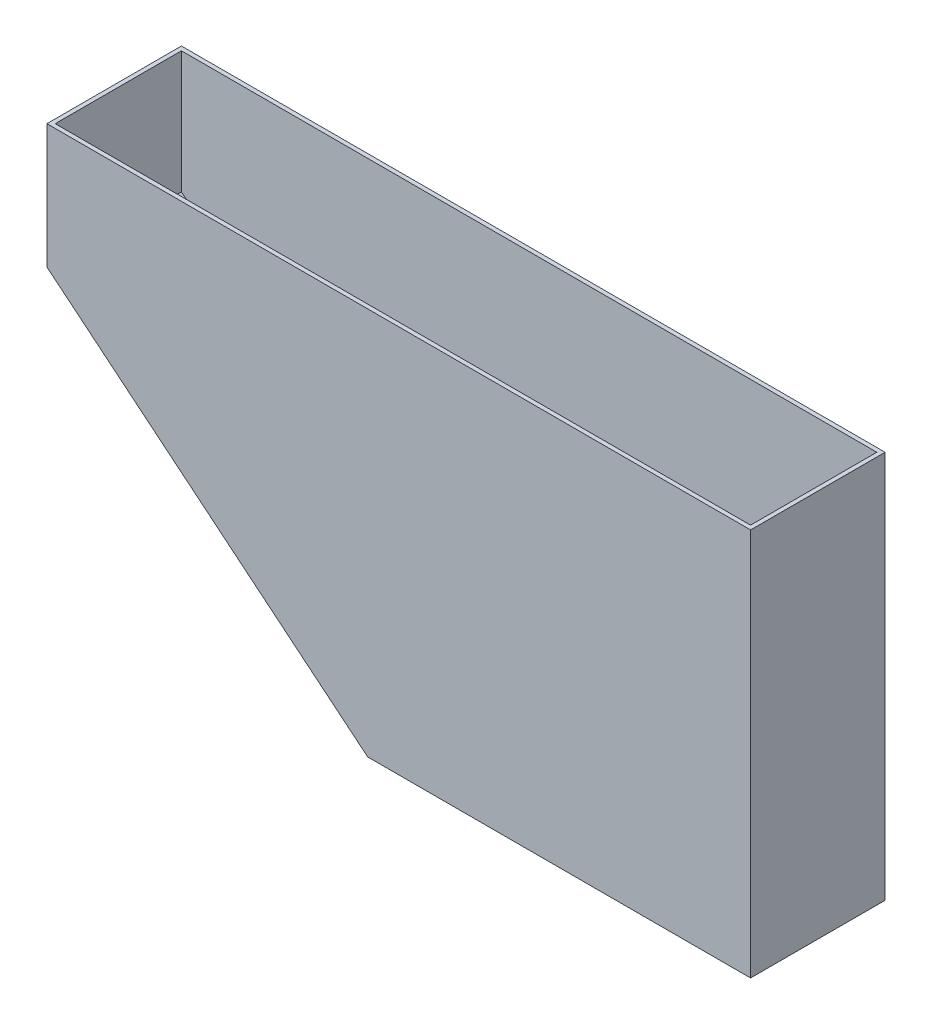
ISO-10303-21;
HEADER;
FILE_DESCRIPTION(('STEP AP214'),'2;1');
FILE_NAME('part.step','',(''),(''),'','','');
FILE_SCHEMA(('AUTOMOTIVE_DESIGN { 1 0 10303 214 1 1 1 1 }'));
ENDSEC;
DATA;
#1=APPLICATION_CONTEXT('core data for automotive mechanical design processes');
#2=APPLICATION_PROTOCOL_DEFINITION('international standard','automotive_design',2000,#1);
#3=PRODUCT_CONTEXT('',#1,'mechanical');
#4=PRODUCT('Part','Part','',(#3));
#5=PRODUCT_RELATED_PRODUCT_CATEGORY('part','',(#4));
#6=PRODUCT_DEFINITION_FORMATION('','',#4);
#7=PRODUCT_DEFINITION_CONTEXT('part definition',#1,'design');
#8=PRODUCT_DEFINITION('design','',#6,#7);
#9=PRODUCT_DEFINITION_SHAPE('','',#8);
#10=(LENGTH_UNIT() NAMED_UNIT(*) SI_UNIT(.MILLI.,.METRE.));
#11=(NAMED_UNIT(*) PLANE_ANGLE_UNIT() SI_UNIT($,.RADIAN.));
#12=(NAMED_UNIT(*) SI_UNIT($,.STERADIAN.) SOLID_ANGLE_UNIT());
#13=UNCERTAINTY_MEASURE_WITH_UNIT(LENGTH_MEASURE(1.E-05),#10,'distance_accuracy_value','');
#14=(GEOMETRIC_REPRESENTATION_CONTEXT(3) GLOBAL_UNCERTAINTY_ASSIGNED_CONTEXT((#13)) GLOBAL_UNIT_ASSIGNED_CONTEXT((#10,
#11,#12)) REPRESENTATION_CONTEXT('',''));
#15=CARTESIAN_POINT('',(0.,0.,0.));
#16=DIRECTION('',(0.,0.,1.));
#17=DIRECTION('',(1.,0.,0.));
#18=AXIS2_PLACEMENT_3D('',#15,#16,#17);
#19=CARTESIAN_POINT('',(-304.073172000549,141.586402266289,130.));
#20=DIRECTION('',(0.,-1.,0.));
#21=DIRECTION('',(0.,0.,-1.));
#22=AXIS2_PLACEMENT_3D('',#19,#20,#21);
#23=PLANE('',#22);
#24=DIRECTION('',(-1.,0.,0.));
#25=VECTOR('',#24,1.);
#26=CARTESIAN_POINT('',(-304.073172000549,141.586402266289,0.));
#27=LINE('',#26,#25);
#28=CARTESIAN_POINT('',(375.926827999451,141.586402266289,0.));
#29=VERTEX_POINT('',#28);
#30=CARTESIAN_POINT('',(-304.073172000549,141.586402266289,0.));
#31=VERTEX_POINT('',#30);
#32=EDGE_CURVE('E83',#29,#31,#27,.T.);
#33=ORIENTED_EDGE('',*,*,#32,.T.);
#34=DIRECTION('',(0.,0.,-1.));
#35=VECTOR('',#34,1.);
#36=CARTESIAN_POINT('',(-304.073172000549,141.586402266289,130.));
#37=LINE('',#36,#35);
#38=CARTESIAN_POINT('',(-304.073172000549,141.586402266289,130.));
#39=VERTEX_POINT('',#38);
#40=EDGE_CURVE('E118',#39,#31,#37,.T.);
#41=ORIENTED_EDGE('',*,*,#40,.F.);
#42=DIRECTION('',(-1.,0.,0.));
#43=VECTOR('',#42,1.);
#44=CARTESIAN_POINT('',(-304.073172000549,141.586402266289,130.));
#45=LINE('',#44,#43);
#46=CARTESIAN_POINT('',(375.926827999451,141.586402266289,130.));
#47=VERTEX_POINT('',#46);
#48=EDGE_CURVE('E59',#47,#39,#45,.T.);
#49=ORIENTED_EDGE('',*,*,#48,.F.);
#50=DIRECTION('',(0.,0.,-1.));
#51=VECTOR('',#50,1.);
#52=CARTESIAN_POINT('',(375.926827999451,141.586402266289,130.));
#53=LINE('',#52,#51);
#54=EDGE_CURVE('E114',#47,#29,#53,.T.);
#55=ORIENTED_EDGE('',*,*,#54,.T.);
#56=EDGE_LOOP('',(#33,#41,#49,#55));
#57=FACE_BOUND('',#56,.T.);
#58=DIRECTION('',(-1.,0.,0.));
#59=VECTOR('',#58,1.);
#60=CARTESIAN_POINT('',(-304.073172000549,141.586402266289,4.));
#61=LINE('',#60,#59);
#62=CARTESIAN_POINT('',(371.926827999451,141.586402266289,4.));
#63=VERTEX_POINT('',#62);
#64=CARTESIAN_POINT('',(-300.073172000549,141.586402266289,4.));
#65=VERTEX_POINT('',#64);
#66=EDGE_CURVE('E143',#63,#65,#61,.T.);
#67=ORIENTED_EDGE('',*,*,#66,.F.);
#68=DIRECTION('',(0.,0.,-1.));
#69=VECTOR('',#68,1.);
#70=CARTESIAN_POINT('',(371.926827999451,141.586402266289,130.));
#71=LINE('',#70,#69);
#72=CARTESIAN_POINT('',(371.926827999451,141.586402266289,126.));
#73=VERTEX_POINT('',#72);
#74=EDGE_CURVE('E148',#73,#63,#71,.T.);
#75=ORIENTED_EDGE('',*,*,#74,.F.);
#76=DIRECTION('',(-1.,0.,0.));
#77=VECTOR('',#76,1.);
#78=CARTESIAN_POINT('',(-304.073172000549,141.586402266289,126.));
#79=LINE('',#78,#77);
#80=CARTESIAN_POINT('',(-300.073172000549,141.586402266289,126.));
#81=VERTEX_POINT('',#80);
#82=EDGE_CURVE('E50',#73,#81,#79,.T.);
#83=ORIENTED_EDGE('',*,*,#82,.T.);
#84=DIRECTION('',(0.,0.,-1.));
#85=VECTOR('',#84,1.);
#86=CARTESIAN_POINT('',(-300.073172000549,141.586402266289,130.));
#87=LINE('',#86,#85);
#88=EDGE_CURVE('E152',#81,#65,#87,.T.);
#89=ORIENTED_EDGE('',*,*,#88,.T.);
#90=EDGE_LOOP('',(#67,#75,#83,#89));
#91=FACE_BOUND('',#90,.T.);
#92=ADVANCED_FACE('F35',(#57,#91),#23,.F.);
#93=CARTESIAN_POINT('',(-304.073172000549,141.586402266289,130.));
#94=DIRECTION('',(1.,0.,0.));
#95=DIRECTION('',(0.,1.,0.));
#96=AXIS2_PLACEMENT_3D('',#93,#94,#95);
#97=PLANE('',#96);
#98=DIRECTION('',(0.,-1.,0.));
#99=VECTOR('',#98,1.);
#100=CARTESIAN_POINT('',(-304.073172000549,141.586402266289,0.));
#101=LINE('',#100,#99);
#102=CARTESIAN_POINT('',(-304.073172000549,21.586402266289,0.));
#103=VERTEX_POINT('',#102);
#104=EDGE_CURVE('E122',#31,#103,#101,.T.);
#105=ORIENTED_EDGE('',*,*,#104,.T.);
#106=DIRECTION('',(0.,0.,-1.));
#107=VECTOR('',#106,1.);
#108=CARTESIAN_POINT('',(-304.073172000549,21.586402266289,130.));
#109=LINE('',#108,#107);
#110=CARTESIAN_POINT('',(-304.073172000549,21.586402266289,130.));
#111=VERTEX_POINT('',#110);
#112=EDGE_CURVE('E11',#111,#103,#109,.T.);
#113=ORIENTED_EDGE('',*,*,#112,.F.);
#114=DIRECTION('',(0.,-1.,0.));
#115=VECTOR('',#114,1.);
#116=CARTESIAN_POINT('',(-304.073172000549,141.586402266289,130.));
#117=LINE('',#116,#115);
#118=EDGE_CURVE('E132',#39,#111,#117,.T.);
#119=ORIENTED_EDGE('',*,*,#118,.F.);
#120=ORIENTED_EDGE('',*,*,#40,.T.);
#121=EDGE_LOOP('',(#105,#113,#119,#120));
#122=FACE_BOUND('',#121,.T.);
#123=ADVANCED_FACE('F37',(#122),#97,.F.);
#124=CARTESIAN_POINT('',(-304.073172000549,21.586402266289,130.));
#125=DIRECTION('',(0.635270539120398,0.772289675009111,0.));
#126=DIRECTION('',(-0.772289675009111,0.635270539120398,0.));
#127=AXIS2_PLACEMENT_3D('',#124,#125,#126);
#128=PLANE('',#127);
#129=DIRECTION('',(0.772289675009111,-0.635270539120398,0.));
#130=VECTOR('',#129,1.);
#131=CARTESIAN_POINT('',(-304.073172000549,21.586402266289,0.));
#132=LINE('',#131,#130);
#133=CARTESIAN_POINT('',(5.92682799945143,-233.413597733711,0.));
#134=VERTEX_POINT('',#133);
#135=EDGE_CURVE('E125',#103,#134,#132,.T.);
#136=ORIENTED_EDGE('',*,*,#135,.T.);
#137=DIRECTION('',(0.,0.,-1.));
#138=VECTOR('',#137,1.);
#139=CARTESIAN_POINT('',(5.92682799945143,-233.413597733711,130.));
#140=LINE('',#139,#138);
#141=CARTESIAN_POINT('',(5.92682799945143,-233.413597733711,130.));
#142=VERTEX_POINT('',#141);
#143=EDGE_CURVE('E43',#142,#134,#140,.T.);
#144=ORIENTED_EDGE('',*,*,#143,.F.);
#145=DIRECTION('',(0.772289675009111,-0.635270539120398,0.));
#146=VECTOR('',#145,1.);
#147=CARTESIAN_POINT('',(-304.073172000549,21.586402266289,130.));
#148=LINE('',#147,#146);
#149=EDGE_CURVE('E91',#111,#142,#148,.T.);
#150=ORIENTED_EDGE('',*,*,#149,.F.);
#151=ORIENTED_EDGE('',*,*,#112,.T.);
#152=EDGE_LOOP('',(#136,#144,#150,#151));
#153=FACE_BOUND('',#152,.T.);
#154=ADVANCED_FACE('F233',(#153),#128,.F.);
#155=CARTESIAN_POINT('',(5.92682799945143,-233.413597733711,130.));
#156=DIRECTION('',(0.,1.,0.));
#157=DIRECTION('',(0.,0.,1.));
#158=AXIS2_PLACEMENT_3D('',#155,#156,#157);
#159=PLANE('',#158);
#160=DIRECTION('',(1.,0.,0.));
#161=VECTOR('',#160,1.);
#162=CARTESIAN_POINT('',(5.92682799945143,-233.413597733711,0.));
#163=LINE('',#162,#161);
#164=CARTESIAN_POINT('',(375.926827999451,-233.413597733711,0.));
#165=VERTEX_POINT('',#164);
#166=EDGE_CURVE('E111',#134,#165,#163,.T.);
#167=ORIENTED_EDGE('',*,*,#166,.T.);
#168=DIRECTION('',(0.,0.,-1.));
#169=VECTOR('',#168,1.);
#170=CARTESIAN_POINT('',(375.926827999451,-233.413597733711,130.));
#171=LINE('',#170,#169);
#172=CARTESIAN_POINT('',(375.926827999451,-233.413597733711,130.));
#173=VERTEX_POINT('',#172);
#174=EDGE_CURVE('E108',#173,#165,#171,.T.);
#175=ORIENTED_EDGE('',*,*,#174,.F.);
#176=DIRECTION('',(1.,0.,0.));
#177=VECTOR('',#176,1.);
#178=CARTESIAN_POINT('',(5.92682799945143,-233.413597733711,130.));
#179=LINE('',#178,#177);
#180=EDGE_CURVE('E98',#142,#173,#179,.T.);
#181=ORIENTED_EDGE('',*,*,#180,.F.);
#182=ORIENTED_EDGE('',*,*,#143,.T.);
#183=EDGE_LOOP('',(#167,#175,#181,#182));
#184=FACE_BOUND('',#183,.T.);
#185=ADVANCED_FACE('F109',(#184),#159,.F.);
#186=CARTESIAN_POINT('',(375.926827999451,141.586402266289,130.));
#187=DIRECTION('',(-1.,0.,0.));
#188=DIRECTION('',(0.,-1.,0.));
#189=AXIS2_PLACEMENT_3D('',#186,#187,#188);
#190=PLANE('',#189);
#191=DIRECTION('',(0.,1.,0.));
#192=VECTOR('',#191,1.);
#193=CARTESIAN_POINT('',(375.926827999451,141.586402266289,0.));
#194=LINE('',#193,#192);
#195=EDGE_CURVE('E129',#165,#29,#194,.T.);
#196=ORIENTED_EDGE('',*,*,#195,.T.);
#197=ORIENTED_EDGE('',*,*,#54,.F.);
#198=DIRECTION('',(0.,1.,0.));
#199=VECTOR('',#198,1.);
#200=CARTESIAN_POINT('',(375.926827999451,141.586402266289,130.));
#201=LINE('',#200,#199);
#202=EDGE_CURVE('E102',#173,#47,#201,.T.);
#203=ORIENTED_EDGE('',*,*,#202,.F.);
#204=ORIENTED_EDGE('',*,*,#174,.T.);
#205=EDGE_LOOP('',(#196,#197,#203,#204));
#206=FACE_BOUND('',#205,.T.);
#207=ADVANCED_FACE('F116',(#206),#190,.F.);
#208=CARTESIAN_POINT('',(0.,0.,130.));
#209=DIRECTION('',(0.,0.,1.));
#210=DIRECTION('',(1.,0.,0.));
#211=AXIS2_PLACEMENT_3D('',#208,#209,#210);
#212=PLANE('',#211);
#213=ORIENTED_EDGE('',*,*,#118,.T.);
#214=ORIENTED_EDGE('',*,*,#149,.T.);
#215=ORIENTED_EDGE('',*,*,#180,.T.);
#216=ORIENTED_EDGE('',*,*,#202,.T.);
#217=ORIENTED_EDGE('',*,*,#48,.T.);
#218=EDGE_LOOP('',(#213,#214,#215,#216,#217));
#219=FACE_BOUND('',#218,.T.);
#220=ADVANCED_FACE('F100',(#219),#212,.T.);
#221=CARTESIAN_POINT('',(0.,0.,0.));
#222=DIRECTION('',(0.,0.,1.));
#223=DIRECTION('',(1.,0.,0.));
#224=AXIS2_PLACEMENT_3D('',#221,#222,#223);
#225=PLANE('',#224);
#226=ORIENTED_EDGE('',*,*,#104,.F.);
#227=ORIENTED_EDGE('',*,*,#32,.F.);
#228=ORIENTED_EDGE('',*,*,#195,.F.);
#229=ORIENTED_EDGE('',*,*,#166,.F.);
#230=ORIENTED_EDGE('',*,*,#135,.F.);
#231=EDGE_LOOP('',(#226,#227,#228,#229,#230));
#232=FACE_BOUND('',#231,.T.);
#233=ADVANCED_FACE('F136',(#232),#225,.F.);
#234=CARTESIAN_POINT('',(-300.073172000549,141.586402266289,130.));
#235=DIRECTION('',(1.,0.,0.));
#236=DIRECTION('',(0.,1.,0.));
#237=AXIS2_PLACEMENT_3D('',#234,#235,#236);
#238=PLANE('',#237);
#239=DIRECTION('',(0.,-1.,0.));
#240=VECTOR('',#239,1.);
#241=CARTESIAN_POINT('',(-300.073172000549,141.586402266289,4.));
#242=LINE('',#241,#240);
#243=CARTESIAN_POINT('',(-300.073172000549,23.4754833853667,4.));
#244=VERTEX_POINT('',#243);
#245=EDGE_CURVE('E177',#65,#244,#242,.T.);
#246=ORIENTED_EDGE('',*,*,#245,.F.);
#247=ORIENTED_EDGE('',*,*,#88,.F.);
#248=DIRECTION('',(0.,-1.,0.));
#249=VECTOR('',#248,1.);
#250=CARTESIAN_POINT('',(-300.073172000549,141.586402266289,126.));
#251=LINE('',#250,#249);
#252=CARTESIAN_POINT('',(-300.073172000549,23.4754833853667,126.));
#253=VERTEX_POINT('',#252);
#254=EDGE_CURVE('E146',#81,#253,#251,.T.);
#255=ORIENTED_EDGE('',*,*,#254,.T.);
#256=DIRECTION('',(0.,0.,-1.));
#257=VECTOR('',#256,1.);
#258=CARTESIAN_POINT('',(-300.073172000549,23.4754833853667,130.));
#259=LINE('',#258,#257);
#260=EDGE_CURVE('E126',#253,#244,#259,.T.);
#261=ORIENTED_EDGE('',*,*,#260,.T.);
#262=EDGE_LOOP('',(#246,#247,#255,#261));
#263=FACE_BOUND('',#262,.T.);
#264=ADVANCED_FACE('F193',(#263),#238,.T.);
#265=CARTESIAN_POINT('',(-301.532089844067,24.6755609663254,130.));
#266=DIRECTION('',(0.635270539120398,0.772289675009111,0.));
#267=DIRECTION('',(-0.772289675009111,0.635270539120398,0.));
#268=AXIS2_PLACEMENT_3D('',#265,#266,#267);
#269=PLANE('',#268);
#270=DIRECTION('',(0.772289675009111,-0.635270539120398,0.));
#271=VECTOR('',#270,1.);
#272=CARTESIAN_POINT('',(-301.532089844067,24.6755609663254,4.));
#273=LINE('',#272,#271);
#274=CARTESIAN_POINT('',(7.36061288931071,-229.413597733711,4.));
#275=VERTEX_POINT('',#274);
#276=EDGE_CURVE('E170',#244,#275,#273,.T.);
#277=ORIENTED_EDGE('',*,*,#276,.F.);
#278=ORIENTED_EDGE('',*,*,#260,.F.);
#279=DIRECTION('',(0.772289675009111,-0.635270539120398,0.));
#280=VECTOR('',#279,1.);
#281=CARTESIAN_POINT('',(-301.532089844067,24.6755609663254,126.));
#282=LINE('',#281,#280);
#283=CARTESIAN_POINT('',(7.36061288931071,-229.413597733711,126.));
#284=VERTEX_POINT('',#283);
#285=EDGE_CURVE('E164',#253,#284,#282,.T.);
#286=ORIENTED_EDGE('',*,*,#285,.T.);
#287=DIRECTION('',(0.,0.,-1.));
#288=VECTOR('',#287,1.);
#289=CARTESIAN_POINT('',(7.36061288931066,-229.413597733711,130.));
#290=LINE('',#289,#288);
#291=EDGE_CURVE('E167',#284,#275,#290,.T.);
#292=ORIENTED_EDGE('',*,*,#291,.T.);
#293=EDGE_LOOP('',(#277,#278,#286,#292));
#294=FACE_BOUND('',#293,.T.);
#295=ADVANCED_FACE('F214',(#294),#269,.T.);
#296=CARTESIAN_POINT('',(5.92682799945143,-229.413597733711,130.));
#297=DIRECTION('',(0.,1.,0.));
#298=DIRECTION('',(0.,0.,1.));
#299=AXIS2_PLACEMENT_3D('',#296,#297,#298);
#300=PLANE('',#299);
#301=DIRECTION('',(1.,0.,0.));
#302=VECTOR('',#301,1.);
#303=CARTESIAN_POINT('',(5.92682799945143,-229.413597733711,4.));
#304=LINE('',#303,#302);
#305=CARTESIAN_POINT('',(371.926827999451,-229.413597733711,4.));
#306=VERTEX_POINT('',#305);
#307=EDGE_CURVE('E161',#275,#306,#304,.T.);
#308=ORIENTED_EDGE('',*,*,#307,.F.);
#309=ORIENTED_EDGE('',*,*,#291,.F.);
#310=DIRECTION('',(1.,0.,0.));
#311=VECTOR('',#310,1.);
#312=CARTESIAN_POINT('',(5.92682799945143,-229.413597733711,126.));
#313=LINE('',#312,#311);
#314=CARTESIAN_POINT('',(371.926827999451,-229.413597733711,126.));
#315=VERTEX_POINT('',#314);
#316=EDGE_CURVE('E158',#284,#315,#313,.T.);
#317=ORIENTED_EDGE('',*,*,#316,.T.);
#318=DIRECTION('',(0.,0.,-1.));
#319=VECTOR('',#318,1.);
#320=CARTESIAN_POINT('',(371.926827999451,-229.413597733711,130.));
#321=LINE('',#320,#319);
#322=EDGE_CURVE('E151',#315,#306,#321,.T.);
#323=ORIENTED_EDGE('',*,*,#322,.T.);
#324=EDGE_LOOP('',(#308,#309,#317,#323));
#325=FACE_BOUND('',#324,.T.);
#326=ADVANCED_FACE('F216',(#325),#300,.T.);
#327=CARTESIAN_POINT('',(371.926827999451,141.586402266289,130.));
#328=DIRECTION('',(-1.,0.,0.));
#329=DIRECTION('',(0.,-1.,0.));
#330=AXIS2_PLACEMENT_3D('',#327,#328,#329);
#331=PLANE('',#330);
#332=DIRECTION('',(0.,1.,0.));
#333=VECTOR('',#332,1.);
#334=CARTESIAN_POINT('',(371.926827999451,141.586402266289,4.));
#335=LINE('',#334,#333);
#336=EDGE_CURVE('E147',#306,#63,#335,.T.);
#337=ORIENTED_EDGE('',*,*,#336,.F.);
#338=ORIENTED_EDGE('',*,*,#322,.F.);
#339=DIRECTION('',(0.,1.,0.));
#340=VECTOR('',#339,1.);
#341=CARTESIAN_POINT('',(371.926827999451,141.586402266289,126.));
#342=LINE('',#341,#340);
#343=EDGE_CURVE('E154',#315,#73,#342,.T.);
#344=ORIENTED_EDGE('',*,*,#343,.T.);
#345=ORIENTED_EDGE('',*,*,#74,.T.);
#346=EDGE_LOOP('',(#337,#338,#344,#345));
#347=FACE_BOUND('',#346,.T.);
#348=ADVANCED_FACE('F219',(#347),#331,.T.);
#349=CARTESIAN_POINT('',(0.,0.,126.));
#350=DIRECTION('',(0.,0.,1.));
#351=DIRECTION('',(1.,0.,0.));
#352=AXIS2_PLACEMENT_3D('',#349,#350,#351);
#353=PLANE('',#352);
#354=ORIENTED_EDGE('',*,*,#254,.F.);
#355=ORIENTED_EDGE('',*,*,#82,.F.);
#356=ORIENTED_EDGE('',*,*,#343,.F.);
#357=ORIENTED_EDGE('',*,*,#316,.F.);
#358=ORIENTED_EDGE('',*,*,#285,.F.);
#359=EDGE_LOOP('',(#354,#355,#356,#357,#358));
#360=FACE_BOUND('',#359,.T.);
#361=ADVANCED_FACE('F211',(#360),#353,.F.);
#362=CARTESIAN_POINT('',(0.,0.,4.));
#363=DIRECTION('',(0.,0.,1.));
#364=DIRECTION('',(1.,0.,0.));
#365=AXIS2_PLACEMENT_3D('',#362,#363,#364);
#366=PLANE('',#365);
#367=ORIENTED_EDGE('',*,*,#245,.T.);
#368=ORIENTED_EDGE('',*,*,#276,.T.);
#369=ORIENTED_EDGE('',*,*,#307,.T.);
#370=ORIENTED_EDGE('',*,*,#336,.T.);
#371=ORIENTED_EDGE('',*,*,#66,.T.);
#372=EDGE_LOOP('',(#367,#368,#369,#370,#371));
#373=FACE_BOUND('',#372,.T.);
#374=ADVANCED_FACE('F186',(#373),#366,.T.);
#375=CLOSED_SHELL('',(#92,#123,#154,#185,#207,#220,#233,#264,#295,#326,#348,#361,#374));
#376=MANIFOLD_SOLID_BREP('B2',#375);
#377=ADVANCED_BREP_SHAPE_REPRESENTATION('',(#18,#376),#14);
#378=SHAPE_DEFINITION_REPRESENTATION(#9,#377);
ENDSEC;
END-ISO-10303-21;
